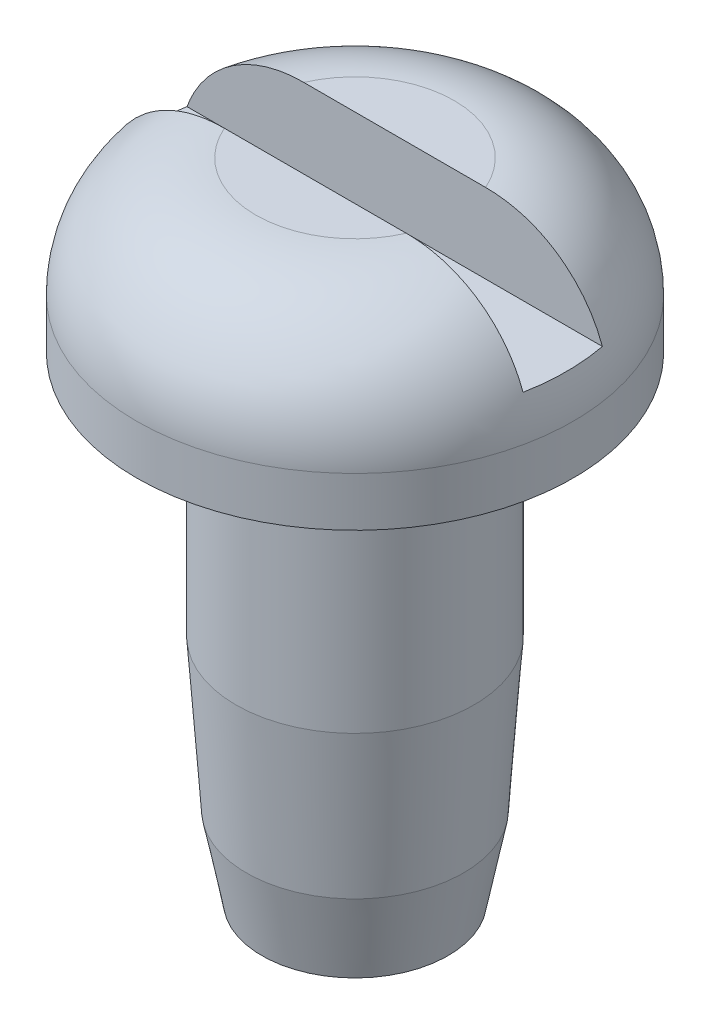
ISO-10303-21;
HEADER;
FILE_DESCRIPTION(('STEP AP214'),'2;1');
FILE_NAME('part.step','',(''),(''),'','','');
FILE_SCHEMA(('AUTOMOTIVE_DESIGN { 1 0 10303 214 1 1 1 1 }'));
ENDSEC;
DATA;
#1=APPLICATION_CONTEXT('core data for automotive mechanical design processes');
#2=APPLICATION_PROTOCOL_DEFINITION('international standard','automotive_design',2000,#1);
#3=PRODUCT_CONTEXT('',#1,'mechanical');
#4=PRODUCT('Part','Part','',(#3));
#5=PRODUCT_RELATED_PRODUCT_CATEGORY('part','',(#4));
#6=PRODUCT_DEFINITION_FORMATION('','',#4);
#7=PRODUCT_DEFINITION_CONTEXT('part definition',#1,'design');
#8=PRODUCT_DEFINITION('design','',#6,#7);
#9=PRODUCT_DEFINITION_SHAPE('','',#8);
#10=(LENGTH_UNIT() NAMED_UNIT(*) SI_UNIT(.MILLI.,.METRE.));
#11=(NAMED_UNIT(*) PLANE_ANGLE_UNIT() SI_UNIT($,.RADIAN.));
#12=(NAMED_UNIT(*) SI_UNIT($,.STERADIAN.) SOLID_ANGLE_UNIT());
#13=UNCERTAINTY_MEASURE_WITH_UNIT(LENGTH_MEASURE(1.E-05),#10,'distance_accuracy_value','');
#14=(GEOMETRIC_REPRESENTATION_CONTEXT(3) GLOBAL_UNCERTAINTY_ASSIGNED_CONTEXT((#13)) GLOBAL_UNIT_ASSIGNED_CONTEXT((#10,
#11,#12)) REPRESENTATION_CONTEXT('',''));
#15=CARTESIAN_POINT('',(0.,0.,0.));
#16=DIRECTION('',(0.,0.,1.));
#17=DIRECTION('',(1.,0.,0.));
#18=AXIS2_PLACEMENT_3D('',#15,#16,#17);
#19=CARTESIAN_POINT('',(0.,8.12,0.));
#20=DIRECTION('',(0.,1.,0.));
#21=DIRECTION('',(0.,0.,1.));
#22=AXIS2_PLACEMENT_3D('',#19,#20,#21);
#23=PLANE('',#22);
#24=DIRECTION('',(1.,0.,0.));
#25=VECTOR('',#24,1.);
#26=CARTESIAN_POINT('',(-5.,8.12,0.5));
#27=LINE('',#26,#25);
#28=CARTESIAN_POINT('',(-1.14564392373896,8.12,0.5));
#29=VERTEX_POINT('',#28);
#30=CARTESIAN_POINT('',(1.14564392373896,8.12,0.5));
#31=VERTEX_POINT('',#30);
#32=EDGE_CURVE('E55',#29,#31,#27,.T.);
#33=ORIENTED_EDGE('',*,*,#32,.F.);
#34=CARTESIAN_POINT('',(0.,8.12,0.));
#35=DIRECTION('',(0.,-1.,0.));
#36=DIRECTION('',(0.,0.,-1.));
#37=AXIS2_PLACEMENT_3D('',#34,#35,#36);
#38=CIRCLE('',#37,1.25);
#39=EDGE_CURVE('E89',#31,#29,#38,.T.);
#40=ORIENTED_EDGE('',*,*,#39,.F.);
#41=EDGE_LOOP('',(#33,#40));
#42=FACE_BOUND('',#41,.T.);
#43=ADVANCED_FACE('F29',(#42),#23,.T.);
#44=CARTESIAN_POINT('',(1.17275874816961,0.,0.));
#45=DIRECTION('',(0.,-1.,0.));
#46=DIRECTION('',(0.,0.,-1.));
#47=AXIS2_PLACEMENT_3D('',#44,#45,#46);
#48=PLANE('',#47);
#49=CARTESIAN_POINT('',(0.,0.,0.));
#50=DIRECTION('',(0.,-1.,0.));
#51=DIRECTION('',(0.,0.,-1.));
#52=AXIS2_PLACEMENT_3D('',#49,#50,#51);
#53=CIRCLE('',#52,1.17275874816961);
#54=CARTESIAN_POINT('',(0.,0.,-1.17275874816961));
#55=VERTEX_POINT('',#54);
#56=EDGE_CURVE('E153',#55,#55,#53,.T.);
#57=ORIENTED_EDGE('',*,*,#56,.T.);
#58=EDGE_LOOP('',(#57));
#59=FACE_BOUND('',#58,.T.);
#60=ADVANCED_FACE('F31',(#59),#48,.T.);
#61=DIRECTION('',(1.,0.,0.));
#62=VECTOR('',#61,1.);
#63=CARTESIAN_POINT('',(-5.,8.12,-0.5));
#64=LINE('',#63,#62);
#65=CARTESIAN_POINT('',(-1.14564392373894,8.12,-0.5));
#66=VERTEX_POINT('',#65);
#67=CARTESIAN_POINT('',(1.14564392373896,8.12,-0.5));
#68=VERTEX_POINT('',#67);
#69=EDGE_CURVE('E147',#66,#68,#64,.T.);
#70=ORIENTED_EDGE('',*,*,#69,.T.);
#71=EDGE_CURVE('E91',#66,#68,#38,.T.);
#72=ORIENTED_EDGE('',*,*,#71,.F.);
#73=EDGE_LOOP('',(#70,#72));
#74=FACE_BOUND('',#73,.T.);
#75=ADVANCED_FACE('F134',(#74),#23,.T.);
#76=CARTESIAN_POINT('',(0.,6.62,0.));
#77=DIRECTION('',(0.,-1.,0.));
#78=DIRECTION('',(0.,0.,-1.));
#79=AXIS2_PLACEMENT_3D('',#76,#77,#78);
#80=DEGENERATE_TOROIDAL_SURFACE('',#79,1.25,1.5,.T.);
#81=CARTESIAN_POINT('',(0.,7.91903810567666,0.5));
#82=CARTESIAN_POINT('',(0.0197737967426219,7.9190369905128,0.5));
#83=CARTESIAN_POINT('',(0.039545997070024,7.91972097422772,0.5));
#84=CARTESIAN_POINT('',(0.0790049364274311,7.9223856518463,0.5));
#85=CARTESIAN_POINT('',(0.0986916568827287,7.92436661465185,0.5));
#86=CARTESIAN_POINT('',(0.157658806665077,7.93201772190164,0.5));
#87=CARTESIAN_POINT('',(0.196712342215652,7.93939416178655,0.5));
#88=CARTESIAN_POINT('',(0.275124136138793,7.95691867254125,0.5));
#89=CARTESIAN_POINT('',(0.314466933281957,7.96712944240032,0.5));
#90=CARTESIAN_POINT('',(0.392871390626709,7.98839358731296,0.5));
#91=CARTESIAN_POINT('',(0.431933305028927,7.99944605597855,0.5));
#92=CARTESIAN_POINT('',(0.501301872096741,8.01871368909932,0.5));
#93=CARTESIAN_POINT('',(0.531587016560785,8.02700433819316,0.5));
#94=CARTESIAN_POINT('',(0.59231873710385,8.04296811701106,0.5));
#95=CARTESIAN_POINT('',(0.622765307602736,8.0506412679342,0.5));
#96=CARTESIAN_POINT('',(0.714444507837877,8.07226873173495,0.5));
#97=CARTESIAN_POINT('',(0.77602264255314,8.0848328671731,0.5));
#98=CARTESIAN_POINT('',(0.89921192641885,8.10450636908717,0.5));
#99=CARTESIAN_POINT('',(0.960811009545613,8.1116882742655,0.5));
#100=CARTESIAN_POINT('',(1.08441181623602,8.11998270844503,0.5));
#101=CARTESIAN_POINT('',(1.14641345705494,8.12109644752245,0.5));
#102=CARTESIAN_POINT('',(1.29839149729665,8.11568080311075,0.5));
#103=CARTESIAN_POINT('',(1.38827496423116,8.10544762646362,0.5));
#104=CARTESIAN_POINT('',(1.5655160441354,8.07010852554206,0.5));
#105=CARTESIAN_POINT('',(1.65286037456457,8.04493545571393,0.5));
#106=CARTESIAN_POINT('',(1.82201022944715,7.97980320122016,0.5));
#107=CARTESIAN_POINT('',(1.90380863536468,7.93982542352841,0.5));
#108=CARTESIAN_POINT('',(2.05893063453845,7.84606037380876,0.5));
#109=CARTESIAN_POINT('',(2.13226621782682,7.79229299585722,0.5));
#110=CARTESIAN_POINT('',(2.26478412131533,7.67539956584984,0.5));
#111=CARTESIAN_POINT('',(2.32448197727165,7.61285721966373,0.5));
#112=CARTESIAN_POINT('',(2.43222659686663,7.4784011875547,0.5));
#113=CARTESIAN_POINT('',(2.48027148226754,7.40648599377457,0.5));
#114=CARTESIAN_POINT('',(2.56214623761733,7.25728685626811,0.5));
#115=CARTESIAN_POINT('',(2.59629751819339,7.18017910279185,0.5));
#116=CARTESIAN_POINT('',(2.6510201495019,7.02129400062946,0.5));
#117=CARTESIAN_POINT('',(2.67159356246283,6.93951736311186,0.5));
#118=CARTESIAN_POINT('',(2.69840777421314,6.77448124410096,0.5));
#119=CARTESIAN_POINT('',(2.70478844563198,6.69124445683348,0.5));
#120=CARTESIAN_POINT('',(2.70344187908911,6.52488375286552,0.5));
#121=CARTESIAN_POINT('',(2.69571462174529,6.44175983632027,0.499999999999999));
#122=CARTESIAN_POINT('',(2.6664238938936,6.2782303265959,0.499999999999999));
#123=CARTESIAN_POINT('',(2.64489941267323,6.19781774341545,0.499999999999999));
#124=CARTESIAN_POINT('',(2.58868989599857,6.04173685310368,0.499999999999999));
#125=CARTESIAN_POINT('',(2.55400522221295,5.96606841566025,0.499999999999999));
#126=CARTESIAN_POINT('',(2.47239136730437,5.82139313741305,0.499999999999999));
#127=CARTESIAN_POINT('',(2.42543044004134,5.75240421302385,0.499999999999999));
#128=CARTESIAN_POINT('',(2.32068991297137,5.62320055409525,0.499999999999999));
#129=CARTESIAN_POINT('',(2.26290986909631,5.56298617988569,0.499999999999999));
#130=CARTESIAN_POINT('',(2.1376383937126,5.4524066505661,0.499999999999999));
#131=CARTESIAN_POINT('',(2.07006224255004,5.4021375411874,0.499999999999999));
#132=CARTESIAN_POINT('',(1.92756642032558,5.31338415072852,0.499999999999999));
#133=CARTESIAN_POINT('',(1.85264537322232,5.2749020835018,0.499999999999999));
#134=CARTESIAN_POINT('',(1.69586550119496,5.20979556853511,0.499999999999999));
#135=CARTESIAN_POINT('',(1.61388894691269,5.18345572003334,0.499999999999999));
#136=CARTESIAN_POINT('',(1.44689684836527,5.14422598061918,0.499999999999999));
#137=CARTESIAN_POINT('',(1.36188552335867,5.13131811481953,0.499999999999999));
#138=CARTESIAN_POINT('',(1.23157222453163,5.12149658917173,0.499999999999999));
#139=CARTESIAN_POINT('',(1.18656268644896,5.11990041822579,0.499999999999999));
#140=CARTESIAN_POINT('',(1.09652167613938,5.12010899856503,0.499999999999999));
#141=CARTESIAN_POINT('',(1.05149020479393,5.12191553458151,0.499999999999999));
#142=CARTESIAN_POINT('',(0.961325647015334,5.12872615390304,0.499999999999999));
#143=CARTESIAN_POINT('',(0.916194508422391,5.13375507198137,0.499999999999999));
#144=CARTESIAN_POINT('',(0.82642303382309,5.14667162268328,0.499999999999999));
#145=CARTESIAN_POINT('',(0.781782036842493,5.15455474106898,0.499999999999999));
#146=CARTESIAN_POINT('',(0.704511960096932,5.1703213912584,0.499999999999999));
#147=CARTESIAN_POINT('',(0.671771535042428,5.17767410717229,0.499999999999999));
#148=CARTESIAN_POINT('',(0.606531309085663,5.19338310482877,0.499999999999999));
#149=CARTESIAN_POINT('',(0.574031532385126,5.20173948609176,0.499999999999999));
#150=CARTESIAN_POINT('',(0.50902660282217,5.21911881844638,0.499999999999999));
#151=CARTESIAN_POINT('',(0.476522363264106,5.22814511639375,0.499999999999999));
#152=CARTESIAN_POINT('',(0.411540765901531,5.24628508113241,0.499999999999999));
#153=CARTESIAN_POINT('',(0.379063406725102,5.25539874312238,0.499999999999999));
#154=CARTESIAN_POINT('',(0.314811102196066,5.27271929870446,0.499999999999999));
#155=CARTESIAN_POINT('',(0.28304115412701,5.2809441425563,0.499999999999999));
#156=CARTESIAN_POINT('',(0.21912227147917,5.29581576847306,0.499999999999999));
#157=CARTESIAN_POINT('',(0.186973413174862,5.3024628626301,0.499999999999999));
#158=CARTESIAN_POINT('',(0.122535986915505,5.31299574174242,0.499999999999999));
#159=CARTESIAN_POINT('',(0.0902522633560652,5.31690924568899,0.499999999999999));
#160=CARTESIAN_POINT('',(0.0254565220278625,5.3211738697098,0.499999999999999));
#161=CARTESIAN_POINT('',(-0.00705527487153988,5.32152805879706,0.499999999999999));
#162=CARTESIAN_POINT('',(-0.0641114600706279,5.31895294789521,0.499999999999999));
#163=CARTESIAN_POINT('',(-0.0886952199397868,5.3167913357537,0.499999999999999));
#164=CARTESIAN_POINT('',(-0.1376461288443,5.31069149052012,0.499999999999999));
#165=CARTESIAN_POINT('',(-0.162013161098763,5.30675235253672,0.499999999999999));
#166=CARTESIAN_POINT('',(-0.210680764188104,5.2975193169645,0.499999999999999));
#167=CARTESIAN_POINT('',(-0.234979261882853,5.29221488458718,0.499999999999999));
#168=CARTESIAN_POINT('',(-0.283365005670841,5.28074448060725,0.499999999999999));
#169=CARTESIAN_POINT('',(-0.307452266115814,5.2745785680243,0.499999999999999));
#170=CARTESIAN_POINT('',(-0.380779475434894,5.25510624869801,0.499999999999999));
#171=CARTESIAN_POINT('',(-0.429830363167436,5.2411101050747,0.499999999999999));
#172=CARTESIAN_POINT('',(-0.52798194146972,5.21390980279642,0.499999999999999));
#173=CARTESIAN_POINT('',(-0.577081931146629,5.20070317855707,0.499999999999999));
#174=CARTESIAN_POINT('',(-0.675177152279305,5.1766798462992,0.499999999999999));
#175=CARTESIAN_POINT('',(-0.724164766426271,5.16583314340996,0.499999999999999));
#176=CARTESIAN_POINT('',(-0.82271790820668,5.14722410901175,0.499999999999999));
#177=CARTESIAN_POINT('',(-0.872283220881639,5.13946066572114,0.499999999999999));
#178=CARTESIAN_POINT('',(-0.9714618095808,5.12766653719701,0.499999999999999));
#179=CARTESIAN_POINT('',(-1.0210714167357,5.12360600589815,0.499999999999999));
#180=CARTESIAN_POINT('',(-1.12043682002785,5.1195016985067,0.499999999999999));
#181=CARTESIAN_POINT('',(-1.17019256864057,5.1194567359602,0.499999999999999));
#182=CARTESIAN_POINT('',(-1.31007808547005,5.1253755312838,0.499999999999999));
#183=CARTESIAN_POINT('',(-1.40006528318003,5.13626602026124,0.499999999999999));
#184=CARTESIAN_POINT('',(-1.57714690188034,5.17294138560288,0.499999999999999));
#185=CARTESIAN_POINT('',(-1.66423528139451,5.1987555318006,0.499999999999999));
#186=CARTESIAN_POINT('',(-1.83282513983102,5.26514806806966,0.499999999999999));
#187=CARTESIAN_POINT('',(-1.91431523553662,5.30575554004196,0.499999999999999));
#188=CARTESIAN_POINT('',(-2.0687843392629,5.40077311982285,0.499999999999999));
#189=CARTESIAN_POINT('',(-2.14176691627206,5.45517740909184,0.499999999999999));
#190=CARTESIAN_POINT('',(-2.2733629164777,5.57316004046121,0.499999999999999));
#191=CARTESIAN_POINT('',(-2.33251475259027,5.63613866059503,0.499999999999999));
#192=CARTESIAN_POINT('',(-2.43908695339319,5.77134153361864,0.499999999999999));
#193=CARTESIAN_POINT('',(-2.48650928065704,5.84356423672181,0.499999999999999));
#194=CARTESIAN_POINT('',(-2.56714602079698,5.99329987399691,0.499999999999999));
#195=CARTESIAN_POINT('',(-2.60067501661592,6.07064357513314,0.499999999999999));
#196=CARTESIAN_POINT('',(-2.65412847292476,6.22989815682362,0.499999999999999));
#197=CARTESIAN_POINT('',(-2.6740536972842,6.31180878065979,0.5));
#198=CARTESIAN_POINT('',(-2.69957055354835,6.47701492711504,0.5));
#199=CARTESIAN_POINT('',(-2.70529958425244,6.56028925853128,0.5));
#200=CARTESIAN_POINT('',(-2.70265446610113,6.72661224981365,0.5));
#201=CARTESIAN_POINT('',(-2.69428074156518,6.8096609163942,0.5));
#202=CARTESIAN_POINT('',(-2.66372171104013,6.97294378541415,0.5));
#203=CARTESIAN_POINT('',(-2.64157356642372,7.05318494886325,0.5));
#204=CARTESIAN_POINT('',(-2.58415506988989,7.20882500017115,0.5));
#205=CARTESIAN_POINT('',(-2.54888454434442,7.2842238239433,0.5));
#206=CARTESIAN_POINT('',(-2.46614594655662,7.42827883747407,0.5));
#207=CARTESIAN_POINT('',(-2.41864421566047,7.496915686834,0.5));
#208=CARTESIAN_POINT('',(-2.31289614361331,7.62532359557806,0.5));
#209=CARTESIAN_POINT('',(-2.25465066655872,7.68509536726438,0.5));
#210=CARTESIAN_POINT('',(-2.12852249718834,7.79472330200188,0.5));
#211=CARTESIAN_POINT('',(-2.06055517165249,7.84448202251314,0.5));
#212=CARTESIAN_POINT('',(-1.91734454137424,7.93218062286366,0.5));
#213=CARTESIAN_POINT('',(-1.84209723549368,7.9701139544596,0.5));
#214=CARTESIAN_POINT('',(-1.6846974467587,8.03409537606032,0.5));
#215=CARTESIAN_POINT('',(-1.60242569324103,8.059849018064,0.5));
#216=CARTESIAN_POINT('',(-1.43502754704401,8.09786107224882,0.5));
#217=CARTESIAN_POINT('',(-1.34990795382501,8.11014955239956,0.5));
#218=CARTESIAN_POINT('',(-1.20921514067649,8.11975160363367,0.5));
#219=CARTESIAN_POINT('',(-1.1538594211603,8.12082840303231,0.5));
#220=CARTESIAN_POINT('',(-1.04325663545321,8.11793821869704,0.5));
#221=CARTESIAN_POINT('',(-0.9880096237223,8.11396914698649,0.5));
#222=CARTESIAN_POINT('',(-0.877454898241034,8.10142962817029,0.5));
#223=CARTESIAN_POINT('',(-0.822152989476216,8.09280988320476,0.5));
#224=CARTESIAN_POINT('',(-0.712340125125806,8.07177706383218,0.5));
#225=CARTESIAN_POINT('',(-0.657828617837629,8.05936678339885,0.5));
#226=CARTESIAN_POINT('',(-0.553004651572946,8.03297018637666,0.5));
#227=CARTESIAN_POINT('',(-0.502650916557355,8.01914022753726,0.5));
#228=CARTESIAN_POINT('',(-0.401924906144865,7.99103689280184,0.5));
#229=CARTESIAN_POINT('',(-0.351552913771805,7.97676247163309,0.5));
#230=CARTESIAN_POINT('',(-0.276142022207296,7.95749613532875,0.5));
#231=CARTESIAN_POINT('',(-0.251369522605794,7.95150008685694,0.5));
#232=CARTESIAN_POINT('',(-0.201572089139237,7.9406356565785,0.5));
#233=CARTESIAN_POINT('',(-0.17654716773965,7.93576721936826,0.5));
#234=CARTESIAN_POINT('',(-0.126355625524989,7.92770226773487,0.5));
#235=CARTESIAN_POINT('',(-0.101190474849766,7.92449696460789,0.5));
#236=CARTESIAN_POINT('',(-0.0506826207314983,7.92016605140756,0.5));
#237=CARTESIAN_POINT('',(-0.0253399995280064,7.91903953475231,0.5));
#238=CARTESIAN_POINT('',(0.,7.91903810567666,0.5));
#239=B_SPLINE_CURVE_WITH_KNOTS('',3,(#81,#82,#83,#84,#85,#86,#87,#88,#89,#90,#91,#92,#93,#94,
#95,#96,#97,#98,#99,#100,#101,#102,#103,#104,#105,#106,#107,#108,#109,#110,#111,#112,#113,#114,
#115,#116,#117,#118,#119,#120,#121,#122,#123,#124,#125,#126,#127,#128,#129,#130,#131,#132,#133,
#134,#135,#136,#137,#138,#139,#140,#141,#142,#143,#144,#145,#146,#147,#148,#149,#150,#151,#152,
#153,#154,#155,#156,#157,#158,#159,#160,#161,#162,#163,#164,#165,#166,#167,#168,#169,#170,#171,
#172,#173,#174,#175,#176,#177,#178,#179,#180,#181,#182,#183,#184,#185,#186,#187,#188,#189,#190,
#191,#192,#193,#194,#195,#196,#197,#198,#199,#200,#201,#202,#203,#204,#205,#206,#207,#208,#209,
#210,#211,#212,#213,#214,#215,#216,#217,#218,#219,#220,#221,#222,#223,#224,#225,#226,#227,#228,
#229,#230,#231,#232,#233,#234,#235,#236,#237,#238),.UNSPECIFIED.,.T.,.F.,(4,2,2,2,2,2,2,2,2,2,2,
2,2,2,2,2,2,2,2,2,2,2,2,2,2,2,2,2,2,2,2,2,2,2,2,2,2,2,2,2,2,2,2,2,2,2,2,2,2,2,2,2,2,2,2,2,2,2,2,
2,2,2,2,2,2,2,2,2,2,2,2,2,2,2,2,2,2,2,4),(0.,0.0593076634889018,0.118627627094602,
0.237666401603138,0.359583225739829,0.481370570670169,0.575564762302632,0.669755718811991,
0.858118806027022,1.04389518048997,1.22963450721934,1.4997908255925,1.77117062309283,
2.04289240496523,2.3142243611401,2.57233466475584,2.83048654324964,3.08227053978,
3.33401628614395,3.58326981923221,3.83252369475662,4.08107629567917,4.32962206636899,
4.57881704117945,4.8280222463825,5.07952778846577,5.3310805396336,5.58826214142042,
5.84509913447087,5.98010333657349,6.1151783685559,6.25130714834008,6.38722155903232,
6.48787091567203,6.58853026064625,6.68973160337025,6.79092741584212,6.88936359709382,
6.98778029058653,7.08518394101472,7.18250359810175,7.25646491957285,7.33046393534475,
7.40505201146822,7.47963498009665,7.63265649956172,7.78517207413611,7.93561833968183,
8.08601030698005,8.23517909210656,8.38430380315933,8.6549592377865,8.92614731972606,
9.19787142742351,9.46948113077631,9.72741738270311,9.98531044767135,10.2369944418546,
10.4886643024902,10.7378886758483,10.9871055507525,11.2356529742415,11.4842036864889,
11.7334458265571,11.9826679293487,12.2342091021297,12.4858893180271,12.7433770223408,
13.000288572397,13.1661692931842,13.3321186776024,13.4998627393571,13.6674834554572,
13.8241310791753,13.9811800408005,14.0576275577146,14.1340713176884,14.210106893345,
14.286109301197),.UNSPECIFIED.);
#240=CARTESIAN_POINT('',(-2.61687483574067,7.12,0.5));
#241=VERTEX_POINT('',#240);
#242=EDGE_CURVE('E11',#241,#29,#239,.T.);
#243=ORIENTED_EDGE('',*,*,#242,.F.);
#244=CARTESIAN_POINT('',(0.,7.12,0.));
#245=DIRECTION('',(0.,-1.,0.));
#246=DIRECTION('',(0.,0.,-1.));
#247=AXIS2_PLACEMENT_3D('',#244,#245,#246);
#248=CIRCLE('',#247,2.66421356237309);
#249=CARTESIAN_POINT('',(-2.61687483574067,7.12,-0.5));
#250=VERTEX_POINT('',#249);
#251=EDGE_CURVE('E73',#250,#241,#248,.F.);
#252=ORIENTED_EDGE('',*,*,#251,.F.);
#253=CARTESIAN_POINT('',(0.,7.91903810567666,-0.5));
#254=CARTESIAN_POINT('',(-0.019773796742622,7.9190369905128,-0.5));
#255=CARTESIAN_POINT('',(-0.0395459970700241,7.91972097422772,-0.5));
#256=CARTESIAN_POINT('',(-0.0790049364274313,7.9223856518463,-0.5));
#257=CARTESIAN_POINT('',(-0.0986916568827288,7.92436661465185,-0.5));
#258=CARTESIAN_POINT('',(-0.157658806665077,7.93201772190164,-0.5));
#259=CARTESIAN_POINT('',(-0.196712342215652,7.93939416178655,-0.5));
#260=CARTESIAN_POINT('',(-0.275124136138794,7.95691867254125,-0.5));
#261=CARTESIAN_POINT('',(-0.314466933281958,7.96712944240032,-0.5));
#262=CARTESIAN_POINT('',(-0.39287139062671,7.98839358731296,-0.5));
#263=CARTESIAN_POINT('',(-0.431933305028928,7.99944605597855,-0.5));
#264=CARTESIAN_POINT('',(-0.501301872096742,8.01871368909932,-0.5));
#265=CARTESIAN_POINT('',(-0.531587016560786,8.02700433819316,-0.5));
#266=CARTESIAN_POINT('',(-0.59231873710385,8.04296811701106,-0.5));
#267=CARTESIAN_POINT('',(-0.622765307602736,8.0506412679342,-0.5));
#268=CARTESIAN_POINT('',(-0.714444507837877,8.07226873173495,-0.5));
#269=CARTESIAN_POINT('',(-0.77602264255314,8.0848328671731,-0.5));
#270=CARTESIAN_POINT('',(-0.899211926418849,8.10450636908717,-0.5));
#271=CARTESIAN_POINT('',(-0.960811009545612,8.1116882742655,-0.5));
#272=CARTESIAN_POINT('',(-1.08441181623602,8.11998270844503,-0.5));
#273=CARTESIAN_POINT('',(-1.14641345705493,8.12109644752245,-0.5));
#274=CARTESIAN_POINT('',(-1.29839149729664,8.11568080311075,-0.5));
#275=CARTESIAN_POINT('',(-1.38827496423116,8.10544762646362,-0.5));
#276=CARTESIAN_POINT('',(-1.5655160441354,8.07010852554206,-0.5));
#277=CARTESIAN_POINT('',(-1.65286037456457,8.04493545571393,-0.5));
#278=CARTESIAN_POINT('',(-1.82201022944715,7.97980320122016,-0.5));
#279=CARTESIAN_POINT('',(-1.90380863536468,7.93982542352841,-0.5));
#280=CARTESIAN_POINT('',(-2.05893063453845,7.84606037380876,-0.5));
#281=CARTESIAN_POINT('',(-2.13226621782682,7.79229299585722,-0.5));
#282=CARTESIAN_POINT('',(-2.26478412131533,7.67539956584984,-0.5));
#283=CARTESIAN_POINT('',(-2.32448197727165,7.61285721966373,-0.5));
#284=CARTESIAN_POINT('',(-2.43222659686663,7.4784011875547,-0.5));
#285=CARTESIAN_POINT('',(-2.48027148226754,7.40648599377456,-0.5));
#286=CARTESIAN_POINT('',(-2.56214623761733,7.25728685626811,-0.5));
#287=CARTESIAN_POINT('',(-2.5962975181934,7.18017910279185,-0.5));
#288=CARTESIAN_POINT('',(-2.6510201495019,7.02129400062946,-0.5));
#289=CARTESIAN_POINT('',(-2.67159356246283,6.93951736311186,-0.5));
#290=CARTESIAN_POINT('',(-2.69840777421314,6.77448124410096,-0.5));
#291=CARTESIAN_POINT('',(-2.70478844563198,6.69124445683348,-0.5));
#292=CARTESIAN_POINT('',(-2.70344187908911,6.52488375286552,-0.5));
#293=CARTESIAN_POINT('',(-2.69571462174529,6.44175983632026,-0.5));
#294=CARTESIAN_POINT('',(-2.6664238938936,6.2782303265959,-0.5));
#295=CARTESIAN_POINT('',(-2.64489941267322,6.19781774341545,-0.5));
#296=CARTESIAN_POINT('',(-2.58868989599857,6.04173685310368,-0.5));
#297=CARTESIAN_POINT('',(-2.55400522221295,5.96606841566024,-0.5));
#298=CARTESIAN_POINT('',(-2.47239136730437,5.82139313741304,-0.5));
#299=CARTESIAN_POINT('',(-2.42543044004134,5.75240421302385,-0.5));
#300=CARTESIAN_POINT('',(-2.32068991297136,5.62320055409525,-0.5));
#301=CARTESIAN_POINT('',(-2.26290986909631,5.56298617988569,-0.5));
#302=CARTESIAN_POINT('',(-2.1376383937126,5.4524066505661,-0.5));
#303=CARTESIAN_POINT('',(-2.07006224255004,5.4021375411874,-0.5));
#304=CARTESIAN_POINT('',(-1.92756642032558,5.31338415072852,-0.5));
#305=CARTESIAN_POINT('',(-1.85264537322231,5.2749020835018,-0.5));
#306=CARTESIAN_POINT('',(-1.69586550119496,5.20979556853511,-0.5));
#307=CARTESIAN_POINT('',(-1.61388894691269,5.18345572003334,-0.5));
#308=CARTESIAN_POINT('',(-1.44689684836527,5.14422598061918,-0.5));
#309=CARTESIAN_POINT('',(-1.36188552335867,5.13131811481953,-0.5));
#310=CARTESIAN_POINT('',(-1.23157222453163,5.12149658917173,-0.5));
#311=CARTESIAN_POINT('',(-1.18656268644896,5.11990041822579,-0.5));
#312=CARTESIAN_POINT('',(-1.09652167613938,5.12010899856503,-0.5));
#313=CARTESIAN_POINT('',(-1.05149020479393,5.12191553458151,-0.5));
#314=CARTESIAN_POINT('',(-0.961325647015334,5.12872615390304,-0.5));
#315=CARTESIAN_POINT('',(-0.916194508422391,5.13375507198137,-0.5));
#316=CARTESIAN_POINT('',(-0.826423033823089,5.14667162268328,-0.5));
#317=CARTESIAN_POINT('',(-0.781782036842492,5.15455474106898,-0.5));
#318=CARTESIAN_POINT('',(-0.704511960096931,5.1703213912584,-0.5));
#319=CARTESIAN_POINT('',(-0.671771535042427,5.17767410717229,-0.5));
#320=CARTESIAN_POINT('',(-0.606531309085662,5.19338310482877,-0.5));
#321=CARTESIAN_POINT('',(-0.574031532385125,5.20173948609176,-0.5));
#322=CARTESIAN_POINT('',(-0.509026602822169,5.21911881844639,-0.5));
#323=CARTESIAN_POINT('',(-0.476522363264104,5.22814511639375,-0.5));
#324=CARTESIAN_POINT('',(-0.41154076590153,5.24628508113241,-0.5));
#325=CARTESIAN_POINT('',(-0.379063406725102,5.25539874312238,-0.5));
#326=CARTESIAN_POINT('',(-0.314811102196066,5.27271929870446,-0.5));
#327=CARTESIAN_POINT('',(-0.283041154127009,5.2809441425563,-0.5));
#328=CARTESIAN_POINT('',(-0.219122271479169,5.29581576847306,-0.5));
#329=CARTESIAN_POINT('',(-0.186973413174861,5.3024628626301,-0.5));
#330=CARTESIAN_POINT('',(-0.122535986915505,5.31299574174242,-0.5));
#331=CARTESIAN_POINT('',(-0.0902522633560646,5.31690924568899,-0.5));
#332=CARTESIAN_POINT('',(-0.0254565220278623,5.3211738697098,-0.5));
#333=CARTESIAN_POINT('',(0.00705527487153984,5.32152805879706,-0.5));
#334=CARTESIAN_POINT('',(0.0641114600706278,5.31895294789521,-0.5));
#335=CARTESIAN_POINT('',(0.088695219939787,5.3167913357537,-0.5));
#336=CARTESIAN_POINT('',(0.137646128844301,5.31069149052012,-0.5));
#337=CARTESIAN_POINT('',(0.162013161098764,5.30675235253672,-0.5));
#338=CARTESIAN_POINT('',(0.210680764188106,5.2975193169645,-0.5));
#339=CARTESIAN_POINT('',(0.234979261882856,5.29221488458718,-0.5));
#340=CARTESIAN_POINT('',(0.283365005670844,5.28074448060725,-0.5));
#341=CARTESIAN_POINT('',(0.307452266115817,5.2745785680243,-0.5));
#342=CARTESIAN_POINT('',(0.380779475434897,5.255106248698,-0.5));
#343=CARTESIAN_POINT('',(0.429830363167441,5.2411101050747,-0.5));
#344=CARTESIAN_POINT('',(0.527981941469726,5.21390980279642,-0.5));
#345=CARTESIAN_POINT('',(0.577081931146635,5.20070317855707,-0.5));
#346=CARTESIAN_POINT('',(0.675177152279313,5.1766798462992,-0.5));
#347=CARTESIAN_POINT('',(0.72416476642628,5.16583314340995,-0.5));
#348=CARTESIAN_POINT('',(0.82271790820669,5.14722410901175,-0.5));
#349=CARTESIAN_POINT('',(0.87228322088165,5.13946066572113,-0.5));
#350=CARTESIAN_POINT('',(0.971461809580811,5.12766653719701,-0.5));
#351=CARTESIAN_POINT('',(1.02107141673571,5.12360600589815,-0.5));
#352=CARTESIAN_POINT('',(1.12043682002786,5.1195016985067,-0.5));
#353=CARTESIAN_POINT('',(1.17019256864059,5.1194567359602,-0.5));
#354=CARTESIAN_POINT('',(1.31007808547007,5.1253755312838,-0.5));
#355=CARTESIAN_POINT('',(1.40006528318004,5.13626602026124,-0.5));
#356=CARTESIAN_POINT('',(1.57714690188036,5.17294138560288,-0.5));
#357=CARTESIAN_POINT('',(1.66423528139453,5.1987555318006,-0.5));
#358=CARTESIAN_POINT('',(1.83282513983103,5.26514806806967,-0.5));
#359=CARTESIAN_POINT('',(1.91431523553663,5.30575554004196,-0.5));
#360=CARTESIAN_POINT('',(2.06878433926291,5.40077311982286,-0.5));
#361=CARTESIAN_POINT('',(2.14176691627207,5.45517740909185,-0.5));
#362=CARTESIAN_POINT('',(2.27336291647771,5.57316004046122,-0.5));
#363=CARTESIAN_POINT('',(2.33251475259027,5.63613866059504,-0.5));
#364=CARTESIAN_POINT('',(2.4390869533932,5.77134153361865,-0.5));
#365=CARTESIAN_POINT('',(2.48650928065704,5.84356423672182,-0.5));
#366=CARTESIAN_POINT('',(2.56714602079698,5.99329987399692,-0.5));
#367=CARTESIAN_POINT('',(2.60067501661592,6.07064357513315,-0.5));
#368=CARTESIAN_POINT('',(2.65412847292476,6.22989815682364,-0.5));
#369=CARTESIAN_POINT('',(2.6740536972842,6.3118087806598,-0.5));
#370=CARTESIAN_POINT('',(2.69957055354835,6.47701492711505,-0.5));
#371=CARTESIAN_POINT('',(2.70529958425244,6.56028925853129,-0.5));
#372=CARTESIAN_POINT('',(2.70265446610113,6.72661224981366,-0.5));
#373=CARTESIAN_POINT('',(2.69428074156518,6.80966091639421,-0.5));
#374=CARTESIAN_POINT('',(2.66372171104012,6.97294378541416,-0.5));
#375=CARTESIAN_POINT('',(2.64157356642371,7.05318494886327,-0.5));
#376=CARTESIAN_POINT('',(2.58415506988989,7.20882500017116,-0.5));
#377=CARTESIAN_POINT('',(2.54888454434441,7.28422382394331,-0.5));
#378=CARTESIAN_POINT('',(2.46614594655662,7.42827883747408,-0.5));
#379=CARTESIAN_POINT('',(2.41864421566047,7.49691568683401,-0.5));
#380=CARTESIAN_POINT('',(2.3128961436133,7.62532359557807,-0.5));
#381=CARTESIAN_POINT('',(2.25465066655872,7.68509536726438,-0.5));
#382=CARTESIAN_POINT('',(2.12852249718833,7.79472330200189,-0.5));
#383=CARTESIAN_POINT('',(2.06055517165248,7.84448202251315,-0.5));
#384=CARTESIAN_POINT('',(1.91734454137422,7.93218062286367,-0.5));
#385=CARTESIAN_POINT('',(1.84209723549367,7.97011395445961,-0.5));
#386=CARTESIAN_POINT('',(1.68469744675868,8.03409537606033,-0.5));
#387=CARTESIAN_POINT('',(1.60242569324101,8.059849018064,-0.5));
#388=CARTESIAN_POINT('',(1.43502754704399,8.09786107224882,-0.5));
#389=CARTESIAN_POINT('',(1.349907953825,8.11014955239956,-0.5));
#390=CARTESIAN_POINT('',(1.20921514067647,8.11975160363367,-0.5));
#391=CARTESIAN_POINT('',(1.15385942116028,8.12082840303231,-0.5));
#392=CARTESIAN_POINT('',(1.04325663545319,8.11793821869704,-0.5));
#393=CARTESIAN_POINT('',(0.988009623722284,8.11396914698649,-0.5));
#394=CARTESIAN_POINT('',(0.877454898241016,8.10142962817029,-0.5));
#395=CARTESIAN_POINT('',(0.822152989476198,8.09280988320476,-0.5));
#396=CARTESIAN_POINT('',(0.712340125125787,8.07177706383217,-0.5));
#397=CARTESIAN_POINT('',(0.657828617837609,8.05936678339885,-0.5));
#398=CARTESIAN_POINT('',(0.553004651572928,8.03297018637666,-0.5));
#399=CARTESIAN_POINT('',(0.502650916557339,8.01914022753725,-0.5));
#400=CARTESIAN_POINT('',(0.401924906144851,7.99103689280183,-0.5));
#401=CARTESIAN_POINT('',(0.351552913771794,7.97676247163309,-0.5));
#402=CARTESIAN_POINT('',(0.276142022207286,7.95749613532875,-0.5));
#403=CARTESIAN_POINT('',(0.251369522605786,7.95150008685694,-0.5));
#404=CARTESIAN_POINT('',(0.20157208913923,7.9406356565785,-0.5));
#405=CARTESIAN_POINT('',(0.176547167739645,7.93576721936826,-0.5));
#406=CARTESIAN_POINT('',(0.126355625524985,7.92770226773487,-0.5));
#407=CARTESIAN_POINT('',(0.101190474849763,7.92449696460789,-0.5));
#408=CARTESIAN_POINT('',(0.0506826207314969,7.92016605140756,-0.5));
#409=CARTESIAN_POINT('',(0.0253399995280056,7.91903953475231,-0.5));
#410=CARTESIAN_POINT('',(0.,7.91903810567666,-0.5));
#411=B_SPLINE_CURVE_WITH_KNOTS('',3,(#253,#254,#255,#256,#257,#258,#259,#260,#261,#262,#263,
#264,#265,#266,#267,#268,#269,#270,#271,#272,#273,#274,#275,#276,#277,#278,#279,#280,#281,#282,
#283,#284,#285,#286,#287,#288,#289,#290,#291,#292,#293,#294,#295,#296,#297,#298,#299,#300,#301,
#302,#303,#304,#305,#306,#307,#308,#309,#310,#311,#312,#313,#314,#315,#316,#317,#318,#319,#320,
#321,#322,#323,#324,#325,#326,#327,#328,#329,#330,#331,#332,#333,#334,#335,#336,#337,#338,#339,
#340,#341,#342,#343,#344,#345,#346,#347,#348,#349,#350,#351,#352,#353,#354,#355,#356,#357,#358,
#359,#360,#361,#362,#363,#364,#365,#366,#367,#368,#369,#370,#371,#372,#373,#374,#375,#376,#377,
#378,#379,#380,#381,#382,#383,#384,#385,#386,#387,#388,#389,#390,#391,#392,#393,#394,#395,#396,
#397,#398,#399,#400,#401,#402,#403,#404,#405,#406,#407,#408,#409,#410),.UNSPECIFIED.,.T.,.F.,(4,
2,2,2,2,2,2,2,2,2,2,2,2,2,2,2,2,2,2,2,2,2,2,2,2,2,2,2,2,2,2,2,2,2,2,2,2,2,2,2,2,2,2,2,2,2,2,2,2,
2,2,2,2,2,2,2,2,2,2,2,2,2,2,2,2,2,2,2,2,2,2,2,2,2,2,2,2,2,4),(0.,0.059307663488902,
0.118627627094602,0.237666401603138,0.35958322573983,0.48137057067017,0.575564762302633,
0.669755718811991,0.858118806027021,1.04389518048997,1.22963450721934,1.4997908255925,
1.77117062309283,2.04289240496523,2.3142243611401,2.57233466475584,2.83048654324964,
3.08227053978,3.33401628614395,3.58326981923221,3.83252369475662,4.08107629567917,
4.32962206636899,4.57881704117945,4.8280222463825,5.07952778846577,5.3310805396336,
5.58826214142042,5.84509913447087,5.98010333657349,6.1151783685559,6.25130714834007,
6.38722155903232,6.48787091567202,6.58853026064625,6.68973160337025,6.79092741584212,
6.88936359709382,6.98778029058653,7.08518394101471,7.18250359810174,7.25646491957284,
7.33046393534475,7.40505201146822,7.47963498009665,7.63265649956172,7.78517207413612,
7.93561833968183,8.08601030698006,8.23517909210657,8.38430380315935,8.65495923778652,
8.92614731972607,9.19787142742352,9.46948113077632,9.72741738270312,9.98531044767136,
10.2369944418546,10.4886643024902,10.7378886758483,10.9871055507525,11.2356529742415,
11.484203686489,11.7334458265571,11.9826679293487,12.2342091021297,12.4858893180271,
12.7433770223408,13.000288572397,13.1661692931842,13.3321186776024,13.4998627393571,
13.6674834554572,13.8241310791753,13.9811800408005,14.0576275577146,14.1340713176884,
14.210106893345,14.286109301197),.UNSPECIFIED.);
#412=EDGE_CURVE('E42',#66,#250,#411,.T.);
#413=ORIENTED_EDGE('',*,*,#412,.F.);
#414=ORIENTED_EDGE('',*,*,#71,.T.);
#415=CARTESIAN_POINT('',(2.61687483574067,7.12,-0.5));
#416=VERTEX_POINT('',#415);
#417=EDGE_CURVE('E93',#416,#68,#411,.T.);
#418=ORIENTED_EDGE('',*,*,#417,.F.);
#419=CARTESIAN_POINT('',(2.61687483574067,7.12,0.5));
#420=VERTEX_POINT('',#419);
#421=EDGE_CURVE('E81',#420,#416,#248,.F.);
#422=ORIENTED_EDGE('',*,*,#421,.F.);
#423=EDGE_CURVE('E33',#31,#420,#239,.T.);
#424=ORIENTED_EDGE('',*,*,#423,.F.);
#425=ORIENTED_EDGE('',*,*,#39,.T.);
#426=EDGE_LOOP('',(#243,#252,#413,#414,#418,#422,#424,#425));
#427=FACE_BOUND('',#426,.T.);
#428=CARTESIAN_POINT('',(0.,6.62,0.));
#429=DIRECTION('',(0.,-1.,0.));
#430=DIRECTION('',(0.,0.,-1.));
#431=AXIS2_PLACEMENT_3D('',#428,#429,#430);
#432=CIRCLE('',#431,2.75);
#433=CARTESIAN_POINT('',(0.,6.62,-2.75));
#434=VERTEX_POINT('',#433);
#435=EDGE_CURVE('E95',#434,#434,#432,.T.);
#436=ORIENTED_EDGE('',*,*,#435,.F.);
#437=EDGE_LOOP('',(#436));
#438=FACE_BOUND('',#437,.T.);
#439=ADVANCED_FACE('F86',(#427,#438),#80,.T.);
#440=CARTESIAN_POINT('',(0.,0.,0.));
#441=DIRECTION('',(0.,-1.,0.));
#442=DIRECTION('',(0.,0.,-1.));
#443=AXIS2_PLACEMENT_3D('',#440,#441,#442);
#444=CYLINDRICAL_SURFACE('',#443,2.75);
#445=ORIENTED_EDGE('',*,*,#435,.T.);
#446=EDGE_LOOP('',(#445));
#447=FACE_BOUND('',#446,.T.);
#448=CARTESIAN_POINT('',(0.,6.,0.));
#449=DIRECTION('',(0.,-1.,0.));
#450=DIRECTION('',(0.,0.,-1.));
#451=AXIS2_PLACEMENT_3D('',#448,#449,#450);
#452=CIRCLE('',#451,2.75);
#453=CARTESIAN_POINT('',(0.,6.,-2.75));
#454=VERTEX_POINT('',#453);
#455=EDGE_CURVE('E164',#454,#454,#452,.T.);
#456=ORIENTED_EDGE('',*,*,#455,.F.);
#457=EDGE_LOOP('',(#456));
#458=FACE_BOUND('',#457,.T.);
#459=ADVANCED_FACE('F126',(#447,#458),#444,.T.);
#460=CARTESIAN_POINT('',(2.75,6.,0.));
#461=DIRECTION('',(0.,-1.,0.));
#462=DIRECTION('',(0.,0.,-1.));
#463=AXIS2_PLACEMENT_3D('',#460,#461,#462);
#464=PLANE('',#463);
#465=ORIENTED_EDGE('',*,*,#455,.T.);
#466=EDGE_LOOP('',(#465));
#467=FACE_BOUND('',#466,.T.);
#468=CARTESIAN_POINT('',(0.,6.,0.));
#469=DIRECTION('',(0.,-1.,0.));
#470=DIRECTION('',(0.,0.,-1.));
#471=AXIS2_PLACEMENT_3D('',#468,#469,#470);
#472=CIRCLE('',#471,1.5);
#473=CARTESIAN_POINT('',(0.,6.,-1.5));
#474=VERTEX_POINT('',#473);
#475=EDGE_CURVE('E162',#474,#474,#472,.T.);
#476=ORIENTED_EDGE('',*,*,#475,.F.);
#477=EDGE_LOOP('',(#476));
#478=FACE_BOUND('',#477,.T.);
#479=ADVANCED_FACE('F123',(#467,#478),#464,.T.);
#480=CARTESIAN_POINT('',(0.,0.,0.));
#481=DIRECTION('',(0.,-1.,0.));
#482=DIRECTION('',(0.,0.,-1.));
#483=AXIS2_PLACEMENT_3D('',#480,#481,#482);
#484=CYLINDRICAL_SURFACE('',#483,1.5);
#485=ORIENTED_EDGE('',*,*,#475,.T.);
#486=EDGE_LOOP('',(#485));
#487=FACE_BOUND('',#486,.T.);
#488=CARTESIAN_POINT('',(0.,2.9,0.));
#489=DIRECTION('',(0.,-1.,0.));
#490=DIRECTION('',(0.,0.,-1.));
#491=AXIS2_PLACEMENT_3D('',#488,#489,#490);
#492=CIRCLE('',#491,1.5);
#493=CARTESIAN_POINT('',(0.,2.9,-1.5));
#494=VERTEX_POINT('',#493);
#495=EDGE_CURVE('E159',#494,#494,#492,.T.);
#496=ORIENTED_EDGE('',*,*,#495,.F.);
#497=EDGE_LOOP('',(#496));
#498=FACE_BOUND('',#497,.T.);
#499=ADVANCED_FACE('F119',(#487,#498),#484,.T.);
#500=CARTESIAN_POINT('',(0.,1.,0.));
#501=DIRECTION('',(0.,1.,0.));
#502=DIRECTION('',(0.,0.,1.));
#503=AXIS2_PLACEMENT_3D('',#500,#501,#502);
#504=CONICAL_SURFACE('',#503,1.36713905730733,0.0698131700797732);
#505=ORIENTED_EDGE('',*,*,#495,.T.);
#506=EDGE_LOOP('',(#505));
#507=FACE_BOUND('',#506,.T.);
#508=CARTESIAN_POINT('',(0.,1.,0.));
#509=DIRECTION('',(0.,-1.,0.));
#510=DIRECTION('',(0.,0.,-1.));
#511=AXIS2_PLACEMENT_3D('',#508,#509,#510);
#512=CIRCLE('',#511,1.36713905730733);
#513=CARTESIAN_POINT('',(0.,1.,-1.36713905730733));
#514=VERTEX_POINT('',#513);
#515=EDGE_CURVE('E156',#514,#514,#512,.T.);
#516=ORIENTED_EDGE('',*,*,#515,.F.);
#517=EDGE_LOOP('',(#516));
#518=FACE_BOUND('',#517,.T.);
#519=ADVANCED_FACE('F115',(#507,#518),#504,.T.);
#520=CARTESIAN_POINT('',(0.,0.,0.));
#521=DIRECTION('',(0.,1.,0.));
#522=DIRECTION('',(0.,0.,1.));
#523=AXIS2_PLACEMENT_3D('',#520,#521,#522);
#524=CONICAL_SURFACE('',#523,1.17275874816961,0.191986217719376);
#525=ORIENTED_EDGE('',*,*,#515,.T.);
#526=EDGE_LOOP('',(#525));
#527=FACE_BOUND('',#526,.T.);
#528=ORIENTED_EDGE('',*,*,#56,.F.);
#529=EDGE_LOOP('',(#528));
#530=FACE_BOUND('',#529,.T.);
#531=ADVANCED_FACE('F112',(#527,#530),#524,.T.);
#532=CARTESIAN_POINT('',(-5.,8.12,0.5));
#533=DIRECTION('',(0.,0.,1.));
#534=DIRECTION('',(0.,-1.,0.));
#535=AXIS2_PLACEMENT_3D('',#532,#533,#534);
#536=PLANE('',#535);
#537=ORIENTED_EDGE('',*,*,#423,.T.);
#538=DIRECTION('',(1.,0.,0.));
#539=VECTOR('',#538,1.);
#540=CARTESIAN_POINT('',(-5.,7.12,0.5));
#541=LINE('',#540,#539);
#542=EDGE_CURVE('E49',#241,#420,#541,.T.);
#543=ORIENTED_EDGE('',*,*,#542,.F.);
#544=ORIENTED_EDGE('',*,*,#242,.T.);
#545=ORIENTED_EDGE('',*,*,#32,.T.);
#546=EDGE_LOOP('',(#537,#543,#544,#545));
#547=FACE_BOUND('',#546,.T.);
#548=ADVANCED_FACE('F82',(#547),#536,.F.);
#549=CARTESIAN_POINT('',(-5.,8.12,-0.5));
#550=DIRECTION('',(0.,0.,-1.));
#551=DIRECTION('',(-1.,0.,0.));
#552=AXIS2_PLACEMENT_3D('',#549,#550,#551);
#553=PLANE('',#552);
#554=ORIENTED_EDGE('',*,*,#412,.T.);
#555=DIRECTION('',(1.,0.,0.));
#556=VECTOR('',#555,1.);
#557=CARTESIAN_POINT('',(-5.,7.12,-0.5));
#558=LINE('',#557,#556);
#559=EDGE_CURVE('E76',#250,#416,#558,.T.);
#560=ORIENTED_EDGE('',*,*,#559,.T.);
#561=ORIENTED_EDGE('',*,*,#417,.T.);
#562=ORIENTED_EDGE('',*,*,#69,.F.);
#563=EDGE_LOOP('',(#554,#560,#561,#562));
#564=FACE_BOUND('',#563,.T.);
#565=ADVANCED_FACE('F103',(#564),#553,.F.);
#566=CARTESIAN_POINT('',(-5.,7.12,0.5));
#567=DIRECTION('',(0.,-1.,0.));
#568=DIRECTION('',(0.,0.,-1.));
#569=AXIS2_PLACEMENT_3D('',#566,#567,#568);
#570=PLANE('',#569);
#571=ORIENTED_EDGE('',*,*,#251,.T.);
#572=ORIENTED_EDGE('',*,*,#542,.T.);
#573=ORIENTED_EDGE('',*,*,#421,.T.);
#574=ORIENTED_EDGE('',*,*,#559,.F.);
#575=EDGE_LOOP('',(#571,#572,#573,#574));
#576=FACE_BOUND('',#575,.T.);
#577=ADVANCED_FACE('F74',(#576),#570,.F.);
#578=CLOSED_SHELL('',(#43,#60,#75,#439,#459,#479,#499,#519,#531,#548,#565,#577));
#579=MANIFOLD_SOLID_BREP('B2',#578);
#580=ADVANCED_BREP_SHAPE_REPRESENTATION('',(#18,#579),#14);
#581=SHAPE_DEFINITION_REPRESENTATION(#9,#580);
ENDSEC;
END-ISO-10303-21;
